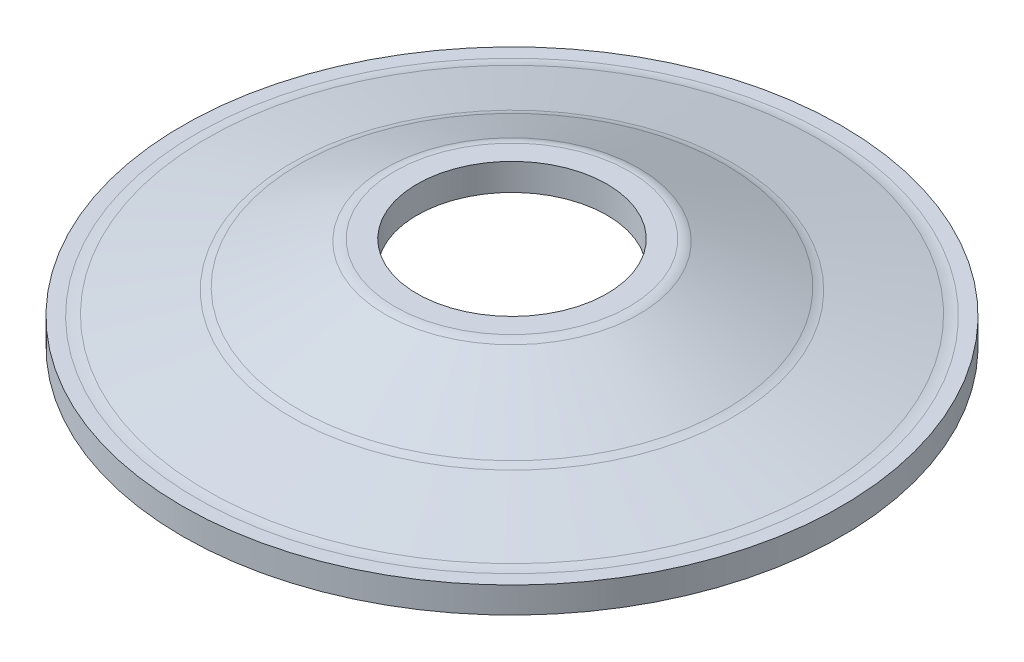
ISO-10303-21;
HEADER;
FILE_DESCRIPTION(('STEP AP214'),'2;1');
FILE_NAME('part.step','',(''),(''),'','','');
FILE_SCHEMA(('AUTOMOTIVE_DESIGN { 1 0 10303 214 1 1 1 1 }'));
ENDSEC;
DATA;
#1=APPLICATION_CONTEXT('core data for automotive mechanical design processes');
#2=APPLICATION_PROTOCOL_DEFINITION('international standard','automotive_design',2000,#1);
#3=PRODUCT_CONTEXT('',#1,'mechanical');
#4=PRODUCT('Part','Part','',(#3));
#5=PRODUCT_RELATED_PRODUCT_CATEGORY('part','',(#4));
#6=PRODUCT_DEFINITION_FORMATION('','',#4);
#7=PRODUCT_DEFINITION_CONTEXT('part definition',#1,'design');
#8=PRODUCT_DEFINITION('design','',#6,#7);
#9=PRODUCT_DEFINITION_SHAPE('','',#8);
#10=(LENGTH_UNIT() NAMED_UNIT(*) SI_UNIT(.MILLI.,.METRE.));
#11=(NAMED_UNIT(*) PLANE_ANGLE_UNIT() SI_UNIT($,.RADIAN.));
#12=(NAMED_UNIT(*) SI_UNIT($,.STERADIAN.) SOLID_ANGLE_UNIT());
#13=UNCERTAINTY_MEASURE_WITH_UNIT(LENGTH_MEASURE(1.E-05),#10,'distance_accuracy_value','');
#14=(GEOMETRIC_REPRESENTATION_CONTEXT(3) GLOBAL_UNCERTAINTY_ASSIGNED_CONTEXT((#13)) GLOBAL_UNIT_ASSIGNED_CONTEXT((#10,
#11,#12)) REPRESENTATION_CONTEXT('',''));
#15=CARTESIAN_POINT('',(0.,0.,0.));
#16=DIRECTION('',(0.,0.,1.));
#17=DIRECTION('',(1.,0.,0.));
#18=AXIS2_PLACEMENT_3D('',#15,#16,#17);
#19=CARTESIAN_POINT('',(0.,-0.0370870799149548,0.));
#20=DIRECTION('',(0.,-1.,0.));
#21=DIRECTION('',(0.,0.,-1.));
#22=AXIS2_PLACEMENT_3D('',#19,#20,#21);
#23=PLANE('',#22);
#24=CARTESIAN_POINT('',(-9.65611178861661,-0.0370870799149548,0.));
#25=DIRECTION('',(0.,-1.,0.));
#26=DIRECTION('',(0.,0.,-1.));
#27=AXIS2_PLACEMENT_3D('',#24,#25,#26);
#28=CIRCLE('',#27,6.24952934387207);
#29=CARTESIAN_POINT('',(-9.65611178861661,-0.0370870799149548,-6.24952934387207));
#30=VERTEX_POINT('',#29);
#31=EDGE_CURVE('E10',#30,#30,#28,.T.);
#32=ORIENTED_EDGE('',*,*,#31,.T.);
#33=EDGE_LOOP('',(#32));
#34=FACE_BOUND('',#33,.T.);
#35=CARTESIAN_POINT('',(-9.65611178861661,-0.0370870799149548,0.));
#36=DIRECTION('',(0.,-1.,0.));
#37=DIRECTION('',(0.,0.,-1.));
#38=AXIS2_PLACEMENT_3D('',#35,#36,#37);
#39=CIRCLE('',#38,5.55625);
#40=CARTESIAN_POINT('',(-9.65611178861661,-0.0370870799149548,-5.55625));
#41=VERTEX_POINT('',#40);
#42=EDGE_CURVE('E67',#41,#41,#39,.T.);
#43=ORIENTED_EDGE('',*,*,#42,.F.);
#44=EDGE_LOOP('',(#43));
#45=FACE_BOUND('',#44,.T.);
#46=ADVANCED_FACE('F15',(#34,#45),#23,.T.);
#47=CARTESIAN_POINT('',(-9.65611178861661,-2.57708707991496,0.));
#48=DIRECTION('',(0.,-1.,0.));
#49=DIRECTION('',(0.,0.,-1.));
#50=AXIS2_PLACEMENT_3D('',#47,#48,#49);
#51=TOROIDAL_SURFACE('',#50,6.24952934387209,2.54);
#52=CARTESIAN_POINT('',(-9.65611178861661,-0.27036583222266,0.));
#53=DIRECTION('',(0.,-1.,0.));
#54=DIRECTION('',(0.,0.,-1.));
#55=AXIS2_PLACEMENT_3D('',#52,#53,#54);
#56=CIRCLE('',#55,7.31284354270746);
#57=CARTESIAN_POINT('',(-9.65611178861661,-0.27036583222266,-7.31284354270746));
#58=VERTEX_POINT('',#57);
#59=EDGE_CURVE('E21',#58,#58,#56,.T.);
#60=ORIENTED_EDGE('',*,*,#59,.T.);
#61=EDGE_LOOP('',(#60));
#62=FACE_BOUND('',#61,.T.);
#63=ORIENTED_EDGE('',*,*,#31,.F.);
#64=EDGE_LOOP('',(#63));
#65=FACE_BOUND('',#64,.T.);
#66=ADVANCED_FACE('F74',(#62,#65),#51,.F.);
#67=CARTESIAN_POINT('',(-9.65611178861661,-2.3322469151299,0.));
#68=DIRECTION('',(0.,-1.,0.));
#69=DIRECTION('',(0.,0.,-1.));
#70=AXIS2_PLACEMENT_3D('',#67,#68,#69);
#71=CONICAL_SURFACE('',#70,11.7858251970165,1.13886268370868);
#72=ORIENTED_EDGE('',*,*,#59,.F.);
#73=EDGE_LOOP('',(#72));
#74=FACE_BOUND('',#73,.T.);
#75=CARTESIAN_POINT('',(-9.65611178861661,-2.3322469151299,0.));
#76=DIRECTION('',(0.,-1.,0.));
#77=DIRECTION('',(0.,0.,-1.));
#78=AXIS2_PLACEMENT_3D('',#75,#76,#77);
#79=CIRCLE('',#78,11.7858251970165);
#80=CARTESIAN_POINT('',(-9.65611178861661,-2.3322469151299,-11.7858251970165));
#81=VERTEX_POINT('',#80);
#82=EDGE_CURVE('E25',#81,#81,#79,.T.);
#83=ORIENTED_EDGE('',*,*,#82,.T.);
#84=EDGE_LOOP('',(#83));
#85=FACE_BOUND('',#84,.T.);
#86=ADVANCED_FACE('F80',(#74,#85),#71,.F.);
#87=CARTESIAN_POINT('',(-9.65611178861661,-0.0255256674376176,0.));
#88=DIRECTION('',(0.,-1.,0.));
#89=DIRECTION('',(0.,0.,-1.));
#90=AXIS2_PLACEMENT_3D('',#87,#88,#89);
#91=TOROIDAL_SURFACE('',#90,12.8491393958519,2.54);
#92=ORIENTED_EDGE('',*,*,#82,.F.);
#93=EDGE_LOOP('',(#92));
#94=FACE_BOUND('',#93,.T.);
#95=CARTESIAN_POINT('',(-9.65611178861661,-2.49028471348324,0.));
#96=DIRECTION('',(0.,-1.,0.));
#97=DIRECTION('',(0.,0.,-1.));
#98=AXIS2_PLACEMENT_3D('',#95,#96,#97);
#99=CIRCLE('',#98,12.2354922293659);
#100=CARTESIAN_POINT('',(-9.65611178861661,-2.49028471348324,-12.2354922293659));
#101=VERTEX_POINT('',#100);
#102=EDGE_CURVE('E29',#101,#101,#99,.T.);
#103=ORIENTED_EDGE('',*,*,#102,.T.);
#104=EDGE_LOOP('',(#103));
#105=FACE_BOUND('',#104,.T.);
#106=ADVANCED_FACE('F85',(#94,#105),#91,.T.);
#107=CARTESIAN_POINT('',(-9.65611178861661,-2.49028471348324,0.));
#108=DIRECTION('',(0.,-1.,0.));
#109=DIRECTION('',(0.,0.,-1.));
#110=AXIS2_PLACEMENT_3D('',#107,#108,#109);
#111=CONICAL_SURFACE('',#110,12.2354922293659,1.32678879748005);
#112=CARTESIAN_POINT('',(-9.65611178861661,-3.81545644625092,0.));
#113=DIRECTION('',(0.,-1.,0.));
#114=DIRECTION('',(0.,0.,-1.));
#115=AXIS2_PLACEMENT_3D('',#112,#113,#114);
#116=CIRCLE('',#115,17.5581421074823);
#117=CARTESIAN_POINT('',(-9.65611178861661,-3.81545644625092,-17.5581421074823));
#118=VERTEX_POINT('',#117);
#119=EDGE_CURVE('E34',#118,#118,#116,.T.);
#120=ORIENTED_EDGE('',*,*,#119,.T.);
#121=EDGE_LOOP('',(#120));
#122=FACE_BOUND('',#121,.T.);
#123=ORIENTED_EDGE('',*,*,#102,.F.);
#124=EDGE_LOOP('',(#123));
#125=FACE_BOUND('',#124,.T.);
#126=ADVANCED_FACE('F92',(#122,#125),#111,.F.);
#127=CARTESIAN_POINT('',(-9.65611178861661,-1.3506974002053,0.));
#128=DIRECTION('',(0.,-1.,0.));
#129=DIRECTION('',(0.,0.,-1.));
#130=AXIS2_PLACEMENT_3D('',#127,#128,#129);
#131=TOROIDAL_SURFACE('',#130,18.1717892739682,2.54);
#132=ORIENTED_EDGE('',*,*,#119,.F.);
#133=EDGE_LOOP('',(#132));
#134=FACE_BOUND('',#133,.T.);
#135=CARTESIAN_POINT('',(-9.65611178861661,-3.8906974002053,0.));
#136=DIRECTION('',(0.,-1.,0.));
#137=DIRECTION('',(0.,0.,-1.));
#138=AXIS2_PLACEMENT_3D('',#135,#136,#137);
#139=CIRCLE('',#138,18.1717892739682);
#140=CARTESIAN_POINT('',(-9.65611178861661,-3.8906974002053,-18.1717892739682));
#141=VERTEX_POINT('',#140);
#142=EDGE_CURVE('E37',#141,#141,#139,.T.);
#143=ORIENTED_EDGE('',*,*,#142,.T.);
#144=EDGE_LOOP('',(#143));
#145=FACE_BOUND('',#144,.T.);
#146=ADVANCED_FACE('F96',(#134,#145),#131,.T.);
#147=CARTESIAN_POINT('',(0.,-3.8906974002053,0.));
#148=DIRECTION('',(0.,1.,0.));
#149=DIRECTION('',(0.,0.,1.));
#150=AXIS2_PLACEMENT_3D('',#147,#148,#149);
#151=PLANE('',#150);
#152=ORIENTED_EDGE('',*,*,#142,.F.);
#153=EDGE_LOOP('',(#152));
#154=FACE_BOUND('',#153,.T.);
#155=CARTESIAN_POINT('',(-9.65611178861661,-3.8906974002053,0.));
#156=DIRECTION('',(0.,-1.,0.));
#157=DIRECTION('',(0.,0.,-1.));
#158=AXIS2_PLACEMENT_3D('',#155,#156,#157);
#159=CIRCLE('',#158,19.2786463927059);
#160=CARTESIAN_POINT('',(-9.65611178861661,-3.8906974002053,-19.2786463927059));
#161=VERTEX_POINT('',#160);
#162=EDGE_CURVE('E40',#161,#161,#159,.T.);
#163=ORIENTED_EDGE('',*,*,#162,.T.);
#164=EDGE_LOOP('',(#163));
#165=FACE_BOUND('',#164,.T.);
#166=ADVANCED_FACE('F100',(#154,#165),#151,.F.);
#167=CARTESIAN_POINT('',(-9.65611178861661,1.53771292008505,0.));
#168=DIRECTION('',(0.,-1.,0.));
#169=DIRECTION('',(0.,0.,-1.));
#170=AXIS2_PLACEMENT_3D('',#167,#168,#169);
#171=CYLINDRICAL_SURFACE('',#170,19.2786463927059);
#172=ORIENTED_EDGE('',*,*,#162,.F.);
#173=EDGE_LOOP('',(#172));
#174=FACE_BOUND('',#173,.T.);
#175=CARTESIAN_POINT('',(-9.65611178861661,-2.36669740020529,0.));
#176=DIRECTION('',(0.,-1.,0.));
#177=DIRECTION('',(0.,0.,-1.));
#178=AXIS2_PLACEMENT_3D('',#175,#176,#177);
#179=CIRCLE('',#178,19.2786463927059);
#180=CARTESIAN_POINT('',(-9.65611178861661,-2.36669740020529,-19.2786463927059));
#181=VERTEX_POINT('',#180);
#182=EDGE_CURVE('E43',#181,#181,#179,.T.);
#183=ORIENTED_EDGE('',*,*,#182,.T.);
#184=EDGE_LOOP('',(#183));
#185=FACE_BOUND('',#184,.T.);
#186=ADVANCED_FACE('F104',(#174,#185),#171,.T.);
#187=CARTESIAN_POINT('',(0.,-2.36669740020529,0.));
#188=DIRECTION('',(0.,-1.,0.));
#189=DIRECTION('',(0.,0.,-1.));
#190=AXIS2_PLACEMENT_3D('',#187,#188,#189);
#191=PLANE('',#190);
#192=ORIENTED_EDGE('',*,*,#182,.F.);
#193=EDGE_LOOP('',(#192));
#194=FACE_BOUND('',#193,.T.);
#195=CARTESIAN_POINT('',(-9.65611178861661,-2.36669740020529,0.));
#196=DIRECTION('',(0.,-1.,0.));
#197=DIRECTION('',(0.,0.,-1.));
#198=AXIS2_PLACEMENT_3D('',#195,#196,#197);
#199=CIRCLE('',#198,18.4657740595867);
#200=CARTESIAN_POINT('',(-9.65611178861661,-2.36669740020529,-18.4657740595867));
#201=VERTEX_POINT('',#200);
#202=EDGE_CURVE('E46',#201,#201,#199,.T.);
#203=ORIENTED_EDGE('',*,*,#202,.T.);
#204=EDGE_LOOP('',(#203));
#205=FACE_BOUND('',#204,.T.);
#206=ADVANCED_FACE('F108',(#194,#205),#191,.F.);
#207=CARTESIAN_POINT('',(-9.65611178861661,0.173302599794714,0.));
#208=DIRECTION('',(0.,-1.,0.));
#209=DIRECTION('',(0.,0.,-1.));
#210=AXIS2_PLACEMENT_3D('',#207,#208,#209);
#211=TOROIDAL_SURFACE('',#210,18.4657740595867,2.54);
#212=CARTESIAN_POINT('',(-9.65611178861661,-2.29177812570366,0.));
#213=DIRECTION('',(0.,-1.,0.));
#214=DIRECTION('',(0.,0.,-1.));
#215=AXIS2_PLACEMENT_3D('',#212,#213,#214);
#216=CIRCLE('',#215,17.8534203899019);
#217=CARTESIAN_POINT('',(-9.65611178861661,-2.29177812570366,-17.8534203899019));
#218=VERTEX_POINT('',#217);
#219=EDGE_CURVE('E49',#218,#218,#216,.T.);
#220=ORIENTED_EDGE('',*,*,#219,.T.);
#221=EDGE_LOOP('',(#220));
#222=FACE_BOUND('',#221,.T.);
#223=ORIENTED_EDGE('',*,*,#202,.F.);
#224=EDGE_LOOP('',(#223));
#225=FACE_BOUND('',#224,.T.);
#226=ADVANCED_FACE('F112',(#222,#225),#211,.F.);
#227=CARTESIAN_POINT('',(-9.65611178861661,-2.29177812570366,0.));
#228=DIRECTION('',(0.,-1.,0.));
#229=DIRECTION('',(0.,0.,-1.));
#230=AXIS2_PLACEMENT_3D('',#227,#228,#229);
#231=CONICAL_SURFACE('',#230,17.8534203899019,1.32731355967578);
#232=CARTESIAN_POINT('',(-9.65611178861661,-1.06015774103203,0.));
#233=DIRECTION('',(0.,-1.,0.));
#234=DIRECTION('',(0.,0.,-1.));
#235=AXIS2_PLACEMENT_3D('',#232,#233,#234);
#236=CIRCLE('',#235,12.8954298989689);
#237=CARTESIAN_POINT('',(-9.65611178861661,-1.06015774103203,-12.8954298989689));
#238=VERTEX_POINT('',#237);
#239=EDGE_CURVE('E52',#238,#238,#236,.T.);
#240=ORIENTED_EDGE('',*,*,#239,.T.);
#241=EDGE_LOOP('',(#240));
#242=FACE_BOUND('',#241,.T.);
#243=ORIENTED_EDGE('',*,*,#219,.F.);
#244=EDGE_LOOP('',(#243));
#245=FACE_BOUND('',#244,.T.);
#246=ADVANCED_FACE('F116',(#242,#245),#231,.T.);
#247=CARTESIAN_POINT('',(-9.65611178861661,1.40492298446636,0.));
#248=DIRECTION('',(0.,-1.,0.));
#249=DIRECTION('',(0.,0.,-1.));
#250=AXIS2_PLACEMENT_3D('',#247,#248,#249);
#251=TOROIDAL_SURFACE('',#250,13.5077835686537,2.54);
#252=CARTESIAN_POINT('',(-9.65611178861661,-0.901798263225936,0.));
#253=DIRECTION('',(0.,-1.,0.));
#254=DIRECTION('',(0.,0.,-1.));
#255=AXIS2_PLACEMENT_3D('',#252,#253,#254);
#256=CIRCLE('',#255,12.4444693698183);
#257=CARTESIAN_POINT('',(-9.65611178861661,-0.901798263225936,-12.4444693698183));
#258=VERTEX_POINT('',#257);
#259=EDGE_CURVE('E55',#258,#258,#256,.T.);
#260=ORIENTED_EDGE('',*,*,#259,.T.);
#261=EDGE_LOOP('',(#260));
#262=FACE_BOUND('',#261,.T.);
#263=ORIENTED_EDGE('',*,*,#239,.F.);
#264=EDGE_LOOP('',(#263));
#265=FACE_BOUND('',#264,.T.);
#266=ADVANCED_FACE('F120',(#262,#265),#251,.F.);
#267=CARTESIAN_POINT('',(-9.65611178861661,-0.901798263225936,0.));
#268=DIRECTION('',(0.,-1.,0.));
#269=DIRECTION('',(0.,0.,-1.));
#270=AXIS2_PLACEMENT_3D('',#267,#268,#269);
#271=CONICAL_SURFACE('',#270,12.4444693698183,1.13886268370868);
#272=CARTESIAN_POINT('',(-9.65611178861661,1.41640796888506,0.));
#273=DIRECTION('',(0.,-1.,0.));
#274=DIRECTION('',(0.,0.,-1.));
#275=AXIS2_PLACEMENT_3D('',#272,#273,#274);
#276=CIRCLE('',#275,7.4154237894996);
#277=CARTESIAN_POINT('',(-9.65611178861661,1.41640796888506,-7.4154237894996));
#278=VERTEX_POINT('',#277);
#279=EDGE_CURVE('E58',#278,#278,#276,.T.);
#280=ORIENTED_EDGE('',*,*,#279,.T.);
#281=EDGE_LOOP('',(#280));
#282=FACE_BOUND('',#281,.T.);
#283=ORIENTED_EDGE('',*,*,#259,.F.);
#284=EDGE_LOOP('',(#283));
#285=FACE_BOUND('',#284,.T.);
#286=ADVANCED_FACE('F124',(#282,#285),#271,.T.);
#287=CARTESIAN_POINT('',(-9.65611178861661,0.21691292008505,0.));
#288=DIRECTION('',(0.,-1.,0.));
#289=DIRECTION('',(0.,0.,-1.));
#290=AXIS2_PLACEMENT_3D('',#287,#288,#289);
#291=TOROIDAL_SURFACE('',#290,6.8625004061052,1.3208);
#292=CARTESIAN_POINT('',(-9.65611178861661,1.53771292008505,0.));
#293=DIRECTION('',(0.,-1.,0.));
#294=DIRECTION('',(0.,0.,-1.));
#295=AXIS2_PLACEMENT_3D('',#292,#293,#294);
#296=CIRCLE('',#295,6.8625004061052);
#297=CARTESIAN_POINT('',(-9.65611178861661,1.53771292008505,-6.8625004061052));
#298=VERTEX_POINT('',#297);
#299=EDGE_CURVE('E61',#298,#298,#296,.T.);
#300=ORIENTED_EDGE('',*,*,#299,.T.);
#301=EDGE_LOOP('',(#300));
#302=FACE_BOUND('',#301,.T.);
#303=ORIENTED_EDGE('',*,*,#279,.F.);
#304=EDGE_LOOP('',(#303));
#305=FACE_BOUND('',#304,.T.);
#306=ADVANCED_FACE('F128',(#302,#305),#291,.T.);
#307=CARTESIAN_POINT('',(0.,1.53771292008505,0.));
#308=DIRECTION('',(0.,-1.,0.));
#309=DIRECTION('',(0.,0.,-1.));
#310=AXIS2_PLACEMENT_3D('',#307,#308,#309);
#311=PLANE('',#310);
#312=ORIENTED_EDGE('',*,*,#299,.F.);
#313=EDGE_LOOP('',(#312));
#314=FACE_BOUND('',#313,.T.);
#315=CARTESIAN_POINT('',(-9.65611178861661,1.53771292008505,0.));
#316=DIRECTION('',(0.,-1.,0.));
#317=DIRECTION('',(0.,0.,-1.));
#318=AXIS2_PLACEMENT_3D('',#315,#316,#317);
#319=CIRCLE('',#318,5.55625);
#320=CARTESIAN_POINT('',(-9.65611178861661,1.53771292008505,-5.55625));
#321=VERTEX_POINT('',#320);
#322=EDGE_CURVE('E64',#321,#321,#319,.T.);
#323=ORIENTED_EDGE('',*,*,#322,.T.);
#324=EDGE_LOOP('',(#323));
#325=FACE_BOUND('',#324,.T.);
#326=ADVANCED_FACE('F132',(#314,#325),#311,.F.);
#327=CARTESIAN_POINT('',(-9.65611178861661,1.53771292008505,0.));
#328=DIRECTION('',(0.,-1.,0.));
#329=DIRECTION('',(0.,0.,-1.));
#330=AXIS2_PLACEMENT_3D('',#327,#328,#329);
#331=CYLINDRICAL_SURFACE('',#330,5.55625);
#332=ORIENTED_EDGE('',*,*,#322,.F.);
#333=EDGE_LOOP('',(#332));
#334=FACE_BOUND('',#333,.T.);
#335=ORIENTED_EDGE('',*,*,#42,.T.);
#336=EDGE_LOOP('',(#335));
#337=FACE_BOUND('',#336,.T.);
#338=ADVANCED_FACE('F71',(#334,#337),#331,.F.);
#339=CLOSED_SHELL('',(#46,#66,#86,#106,#126,#146,#166,#186,#206,#226,#246,#266,#286,#306,#326,#338));
#340=MANIFOLD_SOLID_BREP('B1',#339);
#341=ADVANCED_BREP_SHAPE_REPRESENTATION('',(#18,#340),#14);
#342=SHAPE_DEFINITION_REPRESENTATION(#9,#341);
ENDSEC;
END-ISO-10303-21;
